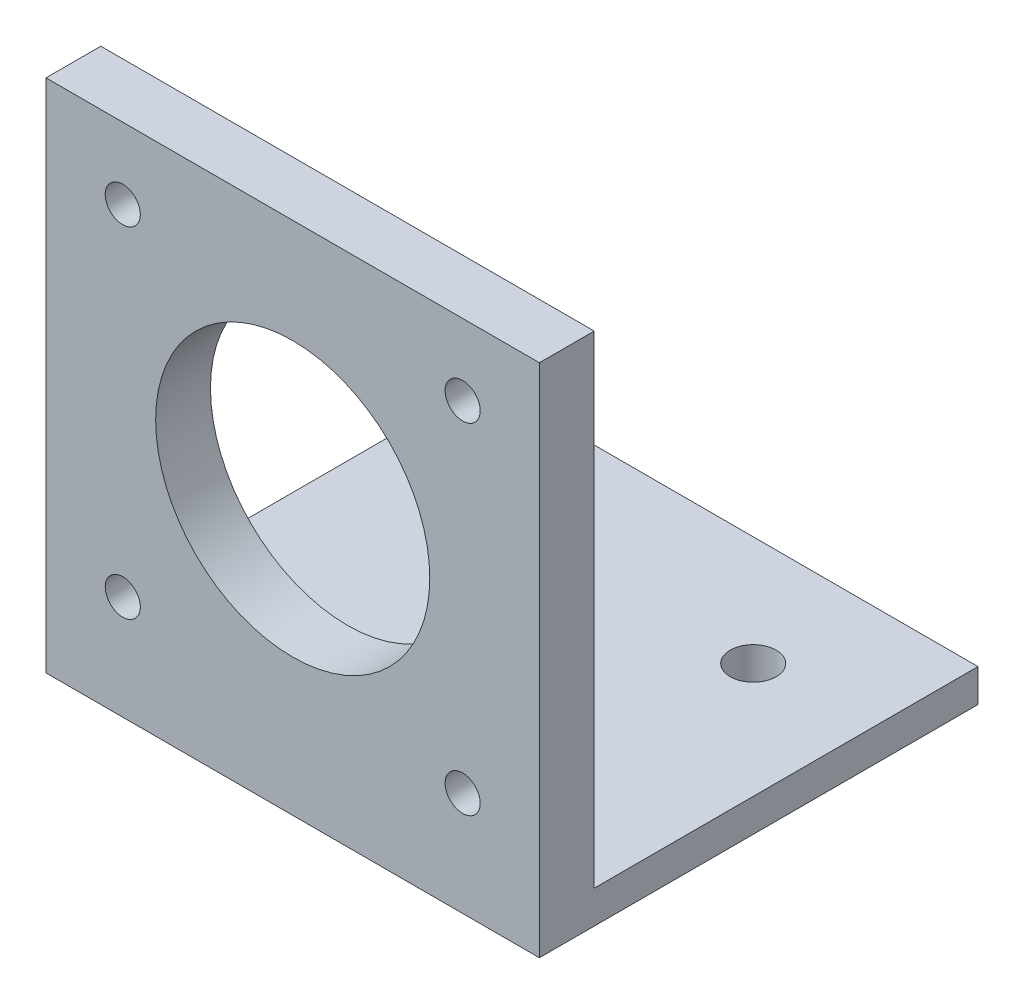
ISO-10303-21;
HEADER;
FILE_DESCRIPTION(('STEP AP214'),'2;1');
FILE_NAME('part.step','',(''),(''),'','','');
FILE_SCHEMA(('AUTOMOTIVE_DESIGN { 1 0 10303 214 1 1 1 1 }'));
ENDSEC;
DATA;
#1=APPLICATION_CONTEXT('core data for automotive mechanical design processes');
#2=APPLICATION_PROTOCOL_DEFINITION('international standard','automotive_design',2000,#1);
#3=PRODUCT_CONTEXT('',#1,'mechanical');
#4=PRODUCT('Part','Part','',(#3));
#5=PRODUCT_RELATED_PRODUCT_CATEGORY('part','',(#4));
#6=PRODUCT_DEFINITION_FORMATION('','',#4);
#7=PRODUCT_DEFINITION_CONTEXT('part definition',#1,'design');
#8=PRODUCT_DEFINITION('design','',#6,#7);
#9=PRODUCT_DEFINITION_SHAPE('','',#8);
#10=(LENGTH_UNIT() NAMED_UNIT(*) SI_UNIT(.MILLI.,.METRE.));
#11=(NAMED_UNIT(*) PLANE_ANGLE_UNIT() SI_UNIT($,.RADIAN.));
#12=(NAMED_UNIT(*) SI_UNIT($,.STERADIAN.) SOLID_ANGLE_UNIT());
#13=UNCERTAINTY_MEASURE_WITH_UNIT(LENGTH_MEASURE(1.E-05),#10,'distance_accuracy_value','');
#14=(GEOMETRIC_REPRESENTATION_CONTEXT(3) GLOBAL_UNCERTAINTY_ASSIGNED_CONTEXT((#13)) GLOBAL_UNIT_ASSIGNED_CONTEXT((#10,
#11,#12)) REPRESENTATION_CONTEXT('',''));
#15=CARTESIAN_POINT('',(0.,0.,0.));
#16=DIRECTION('',(0.,0.,1.));
#17=DIRECTION('',(1.,0.,0.));
#18=AXIS2_PLACEMENT_3D('',#15,#16,#17);
#19=CARTESIAN_POINT('',(22.5,3.,20.));
#20=DIRECTION('',(-1.,0.,0.));
#21=DIRECTION('',(0.,0.,1.));
#22=AXIS2_PLACEMENT_3D('',#19,#20,#21);
#23=PLANE('',#22);
#24=DIRECTION('',(0.,0.,-1.));
#25=VECTOR('',#24,1.);
#26=CARTESIAN_POINT('',(22.5,0.,20.));
#27=LINE('',#26,#25);
#28=CARTESIAN_POINT('',(22.5,0.,20.));
#29=VERTEX_POINT('',#28);
#30=CARTESIAN_POINT('',(22.5,0.,-20.));
#31=VERTEX_POINT('',#30);
#32=EDGE_CURVE('E95',#29,#31,#27,.T.);
#33=ORIENTED_EDGE('',*,*,#32,.T.);
#34=DIRECTION('',(0.,-1.,0.));
#35=VECTOR('',#34,1.);
#36=CARTESIAN_POINT('',(22.5,3.,-20.));
#37=LINE('',#36,#35);
#38=CARTESIAN_POINT('',(22.5,3.,-20.));
#39=VERTEX_POINT('',#38);
#40=EDGE_CURVE('E11',#39,#31,#37,.T.);
#41=ORIENTED_EDGE('',*,*,#40,.F.);
#42=DIRECTION('',(0.,0.,-1.));
#43=VECTOR('',#42,1.);
#44=CARTESIAN_POINT('',(22.5,3.,20.));
#45=LINE('',#44,#43);
#46=CARTESIAN_POINT('',(22.5,3.,15.));
#47=VERTEX_POINT('',#46);
#48=EDGE_CURVE('E88',#47,#39,#45,.T.);
#49=ORIENTED_EDGE('',*,*,#48,.F.);
#50=DIRECTION('',(0.,-1.,0.));
#51=VECTOR('',#50,1.);
#52=CARTESIAN_POINT('',(22.5,47.,15.));
#53=LINE('',#52,#51);
#54=CARTESIAN_POINT('',(22.5,47.,15.));
#55=VERTEX_POINT('',#54);
#56=EDGE_CURVE('E47',#55,#47,#53,.T.);
#57=ORIENTED_EDGE('',*,*,#56,.F.);
#58=DIRECTION('',(0.,0.,-1.));
#59=VECTOR('',#58,1.);
#60=CARTESIAN_POINT('',(22.5,47.,20.));
#61=LINE('',#60,#59);
#62=CARTESIAN_POINT('',(22.5,47.,20.));
#63=VERTEX_POINT('',#62);
#64=EDGE_CURVE('E97',#63,#55,#61,.T.);
#65=ORIENTED_EDGE('',*,*,#64,.F.);
#66=DIRECTION('',(0.,-1.,0.));
#67=VECTOR('',#66,1.);
#68=CARTESIAN_POINT('',(22.5,3.,20.));
#69=LINE('',#68,#67);
#70=EDGE_CURVE('E81',#63,#29,#69,.T.);
#71=ORIENTED_EDGE('',*,*,#70,.T.);
#72=EDGE_LOOP('',(#33,#41,#49,#57,#65,#71));
#73=FACE_BOUND('',#72,.T.);
#74=ADVANCED_FACE('F33',(#73),#23,.F.);
#75=CARTESIAN_POINT('',(-22.5,3.,-20.));
#76=DIRECTION('',(0.,0.,1.));
#77=DIRECTION('',(1.,0.,0.));
#78=AXIS2_PLACEMENT_3D('',#75,#76,#77);
#79=PLANE('',#78);
#80=DIRECTION('',(-1.,0.,0.));
#81=VECTOR('',#80,1.);
#82=CARTESIAN_POINT('',(-22.5,0.,-20.));
#83=LINE('',#82,#81);
#84=CARTESIAN_POINT('',(-22.5,0.,-20.));
#85=VERTEX_POINT('',#84);
#86=EDGE_CURVE('E101',#31,#85,#83,.T.);
#87=ORIENTED_EDGE('',*,*,#86,.T.);
#88=DIRECTION('',(0.,-1.,0.));
#89=VECTOR('',#88,1.);
#90=CARTESIAN_POINT('',(-22.5,3.,-20.));
#91=LINE('',#90,#89);
#92=CARTESIAN_POINT('',(-22.5,3.,-20.));
#93=VERTEX_POINT('',#92);
#94=EDGE_CURVE('E40',#93,#85,#91,.T.);
#95=ORIENTED_EDGE('',*,*,#94,.F.);
#96=DIRECTION('',(-1.,0.,0.));
#97=VECTOR('',#96,1.);
#98=CARTESIAN_POINT('',(-22.5,3.,-20.));
#99=LINE('',#98,#97);
#100=EDGE_CURVE('E56',#39,#93,#99,.T.);
#101=ORIENTED_EDGE('',*,*,#100,.F.);
#102=ORIENTED_EDGE('',*,*,#40,.T.);
#103=EDGE_LOOP('',(#87,#95,#101,#102));
#104=FACE_BOUND('',#103,.T.);
#105=ADVANCED_FACE('F118',(#104),#79,.F.);
#106=CARTESIAN_POINT('',(-22.5,3.,20.));
#107=DIRECTION('',(1.,0.,0.));
#108=DIRECTION('',(0.,0.,-1.));
#109=AXIS2_PLACEMENT_3D('',#106,#107,#108);
#110=PLANE('',#109);
#111=DIRECTION('',(0.,0.,1.));
#112=VECTOR('',#111,1.);
#113=CARTESIAN_POINT('',(-22.5,0.,20.));
#114=LINE('',#113,#112);
#115=CARTESIAN_POINT('',(-22.5,0.,20.));
#116=VERTEX_POINT('',#115);
#117=EDGE_CURVE('E89',#85,#116,#114,.T.);
#118=ORIENTED_EDGE('',*,*,#117,.T.);
#119=DIRECTION('',(0.,-1.,0.));
#120=VECTOR('',#119,1.);
#121=CARTESIAN_POINT('',(-22.5,3.,20.));
#122=LINE('',#121,#120);
#123=CARTESIAN_POINT('',(-22.5,47.,20.));
#124=VERTEX_POINT('',#123);
#125=EDGE_CURVE('E84',#124,#116,#122,.T.);
#126=ORIENTED_EDGE('',*,*,#125,.F.);
#127=DIRECTION('',(0.,0.,-1.));
#128=VECTOR('',#127,1.);
#129=CARTESIAN_POINT('',(-22.5,47.,20.));
#130=LINE('',#129,#128);
#131=CARTESIAN_POINT('',(-22.5,47.,15.));
#132=VERTEX_POINT('',#131);
#133=EDGE_CURVE('E149',#124,#132,#130,.T.);
#134=ORIENTED_EDGE('',*,*,#133,.T.);
#135=DIRECTION('',(0.,-1.,0.));
#136=VECTOR('',#135,1.);
#137=CARTESIAN_POINT('',(-22.5,47.,15.));
#138=LINE('',#137,#136);
#139=CARTESIAN_POINT('',(-22.5,3.,15.));
#140=VERTEX_POINT('',#139);
#141=EDGE_CURVE('E143',#132,#140,#138,.T.);
#142=ORIENTED_EDGE('',*,*,#141,.T.);
#143=DIRECTION('',(0.,0.,1.));
#144=VECTOR('',#143,1.);
#145=CARTESIAN_POINT('',(-22.5,3.,20.));
#146=LINE('',#145,#144);
#147=EDGE_CURVE('E98',#93,#140,#146,.T.);
#148=ORIENTED_EDGE('',*,*,#147,.F.);
#149=ORIENTED_EDGE('',*,*,#94,.T.);
#150=EDGE_LOOP('',(#118,#126,#134,#142,#148,#149));
#151=FACE_BOUND('',#150,.T.);
#152=ADVANCED_FACE('F115',(#151),#110,.F.);
#153=CARTESIAN_POINT('',(-22.5,3.,20.));
#154=DIRECTION('',(0.,0.,-1.));
#155=DIRECTION('',(-1.,0.,0.));
#156=AXIS2_PLACEMENT_3D('',#153,#154,#155);
#157=PLANE('',#156);
#158=CARTESIAN_POINT('',(0.,25.,20.));
#159=DIRECTION('',(0.,0.,-1.));
#160=DIRECTION('',(-1.,0.,0.));
#161=AXIS2_PLACEMENT_3D('',#158,#159,#160);
#162=CIRCLE('',#161,12.5);
#163=CARTESIAN_POINT('',(-12.5,25.,20.));
#164=VERTEX_POINT('',#163);
#165=EDGE_CURVE('E166',#164,#164,#162,.T.);
#166=ORIENTED_EDGE('',*,*,#165,.T.);
#167=EDGE_LOOP('',(#166));
#168=FACE_BOUND('',#167,.T.);
#169=CARTESIAN_POINT('',(15.5,9.5,20.));
#170=DIRECTION('',(0.,0.,-1.));
#171=DIRECTION('',(1.,0.,0.));
#172=AXIS2_PLACEMENT_3D('',#169,#170,#171);
#173=CIRCLE('',#172,1.6);
#174=CARTESIAN_POINT('',(17.1,9.5,20.));
#175=VERTEX_POINT('',#174);
#176=EDGE_CURVE('E172',#175,#175,#173,.T.);
#177=ORIENTED_EDGE('',*,*,#176,.T.);
#178=EDGE_LOOP('',(#177));
#179=FACE_BOUND('',#178,.T.);
#180=CARTESIAN_POINT('',(-15.5,9.49999999999999,20.));
#181=DIRECTION('',(0.,0.,-1.));
#182=DIRECTION('',(-1.,0.,0.));
#183=AXIS2_PLACEMENT_3D('',#180,#181,#182);
#184=CIRCLE('',#183,1.6);
#185=CARTESIAN_POINT('',(-17.1,9.49999999999999,20.));
#186=VERTEX_POINT('',#185);
#187=EDGE_CURVE('E178',#186,#186,#184,.T.);
#188=ORIENTED_EDGE('',*,*,#187,.T.);
#189=EDGE_LOOP('',(#188));
#190=FACE_BOUND('',#189,.T.);
#191=CARTESIAN_POINT('',(-15.5,40.5,20.));
#192=DIRECTION('',(0.,0.,-1.));
#193=DIRECTION('',(1.,0.,0.));
#194=AXIS2_PLACEMENT_3D('',#191,#192,#193);
#195=CIRCLE('',#194,1.6);
#196=CARTESIAN_POINT('',(-13.9,40.5,20.));
#197=VERTEX_POINT('',#196);
#198=EDGE_CURVE('E160',#197,#197,#195,.T.);
#199=ORIENTED_EDGE('',*,*,#198,.T.);
#200=EDGE_LOOP('',(#199));
#201=FACE_BOUND('',#200,.T.);
#202=CARTESIAN_POINT('',(15.5,40.5,20.));
#203=DIRECTION('',(0.,0.,-1.));
#204=DIRECTION('',(-1.,0.,0.));
#205=AXIS2_PLACEMENT_3D('',#202,#203,#204);
#206=CIRCLE('',#205,1.6);
#207=CARTESIAN_POINT('',(13.9,40.5,20.));
#208=VERTEX_POINT('',#207);
#209=EDGE_CURVE('E150',#208,#208,#206,.T.);
#210=ORIENTED_EDGE('',*,*,#209,.T.);
#211=EDGE_LOOP('',(#210));
#212=FACE_BOUND('',#211,.T.);
#213=DIRECTION('',(1.,0.,0.));
#214=VECTOR('',#213,1.);
#215=CARTESIAN_POINT('',(-22.5,0.,20.));
#216=LINE('',#215,#214);
#217=EDGE_CURVE('E76',#116,#29,#216,.T.);
#218=ORIENTED_EDGE('',*,*,#217,.T.);
#219=ORIENTED_EDGE('',*,*,#70,.F.);
#220=DIRECTION('',(1.,0.,0.));
#221=VECTOR('',#220,1.);
#222=CARTESIAN_POINT('',(-22.5,47.,20.));
#223=LINE('',#222,#221);
#224=EDGE_CURVE('E145',#124,#63,#223,.T.);
#225=ORIENTED_EDGE('',*,*,#224,.F.);
#226=ORIENTED_EDGE('',*,*,#125,.T.);
#227=EDGE_LOOP('',(#218,#219,#225,#226));
#228=FACE_BOUND('',#227,.T.);
#229=ADVANCED_FACE('F78',(#168,#179,#190,#201,#212,#228),#157,.F.);
#230=CARTESIAN_POINT('',(0.,3.,0.));
#231=DIRECTION('',(0.,-1.,0.));
#232=DIRECTION('',(0.,0.,-1.));
#233=AXIS2_PLACEMENT_3D('',#230,#231,#232);
#234=PLANE('',#233);
#235=CARTESIAN_POINT('',(-12.,3.,10.));
#236=DIRECTION('',(0.,1.,0.));
#237=DIRECTION('',(0.,0.,-1.));
#238=AXIS2_PLACEMENT_3D('',#235,#236,#237);
#239=CIRCLE('',#238,2.1);
#240=CARTESIAN_POINT('',(-12.,3.,7.9));
#241=VERTEX_POINT('',#240);
#242=EDGE_CURVE('E126',#241,#241,#239,.T.);
#243=ORIENTED_EDGE('',*,*,#242,.F.);
#244=EDGE_LOOP('',(#243));
#245=FACE_BOUND('',#244,.T.);
#246=CARTESIAN_POINT('',(12.,3.,10.));
#247=DIRECTION('',(0.,1.,0.));
#248=DIRECTION('',(0.,0.,1.));
#249=AXIS2_PLACEMENT_3D('',#246,#247,#248);
#250=CIRCLE('',#249,2.1);
#251=CARTESIAN_POINT('',(12.,3.,12.1));
#252=VERTEX_POINT('',#251);
#253=EDGE_CURVE('E132',#252,#252,#250,.T.);
#254=ORIENTED_EDGE('',*,*,#253,.F.);
#255=EDGE_LOOP('',(#254));
#256=FACE_BOUND('',#255,.T.);
#257=CARTESIAN_POINT('',(12.,3.,-10.));
#258=DIRECTION('',(0.,1.,0.));
#259=DIRECTION('',(0.,0.,-1.));
#260=AXIS2_PLACEMENT_3D('',#257,#258,#259);
#261=CIRCLE('',#260,2.1);
#262=CARTESIAN_POINT('',(12.,3.,-12.1));
#263=VERTEX_POINT('',#262);
#264=EDGE_CURVE('E138',#263,#263,#261,.T.);
#265=ORIENTED_EDGE('',*,*,#264,.F.);
#266=EDGE_LOOP('',(#265));
#267=FACE_BOUND('',#266,.T.);
#268=CARTESIAN_POINT('',(-12.,3.,-10.));
#269=DIRECTION('',(0.,1.,0.));
#270=DIRECTION('',(0.,0.,1.));
#271=AXIS2_PLACEMENT_3D('',#268,#269,#270);
#272=CIRCLE('',#271,2.1);
#273=CARTESIAN_POINT('',(-12.,3.,-7.9));
#274=VERTEX_POINT('',#273);
#275=EDGE_CURVE('E106',#274,#274,#272,.T.);
#276=ORIENTED_EDGE('',*,*,#275,.F.);
#277=EDGE_LOOP('',(#276));
#278=FACE_BOUND('',#277,.T.);
#279=ORIENTED_EDGE('',*,*,#147,.T.);
#280=DIRECTION('',(1.,0.,0.));
#281=VECTOR('',#280,1.);
#282=CARTESIAN_POINT('',(-22.5,3.,15.));
#283=LINE('',#282,#281);
#284=EDGE_CURVE('E147',#140,#47,#283,.T.);
#285=ORIENTED_EDGE('',*,*,#284,.T.);
#286=ORIENTED_EDGE('',*,*,#48,.T.);
#287=ORIENTED_EDGE('',*,*,#100,.T.);
#288=EDGE_LOOP('',(#279,#285,#286,#287));
#289=FACE_BOUND('',#288,.T.);
#290=ADVANCED_FACE('F209',(#245,#256,#267,#278,#289),#234,.F.);
#291=CARTESIAN_POINT('',(0.,0.,0.));
#292=DIRECTION('',(0.,-1.,0.));
#293=DIRECTION('',(0.,0.,-1.));
#294=AXIS2_PLACEMENT_3D('',#291,#292,#293);
#295=PLANE('',#294);
#296=CARTESIAN_POINT('',(-12.,0.,10.));
#297=DIRECTION('',(0.,1.,0.));
#298=DIRECTION('',(0.,0.,-1.));
#299=AXIS2_PLACEMENT_3D('',#296,#297,#298);
#300=CIRCLE('',#299,2.1);
#301=CARTESIAN_POINT('',(-12.,0.,7.9));
#302=VERTEX_POINT('',#301);
#303=EDGE_CURVE('E129',#302,#302,#300,.T.);
#304=ORIENTED_EDGE('',*,*,#303,.T.);
#305=EDGE_LOOP('',(#304));
#306=FACE_BOUND('',#305,.T.);
#307=CARTESIAN_POINT('',(12.,0.,10.));
#308=DIRECTION('',(0.,1.,0.));
#309=DIRECTION('',(0.,0.,1.));
#310=AXIS2_PLACEMENT_3D('',#307,#308,#309);
#311=CIRCLE('',#310,2.1);
#312=CARTESIAN_POINT('',(12.,0.,12.1));
#313=VERTEX_POINT('',#312);
#314=EDGE_CURVE('E135',#313,#313,#311,.T.);
#315=ORIENTED_EDGE('',*,*,#314,.T.);
#316=EDGE_LOOP('',(#315));
#317=FACE_BOUND('',#316,.T.);
#318=CARTESIAN_POINT('',(12.,0.,-10.));
#319=DIRECTION('',(0.,1.,0.));
#320=DIRECTION('',(0.,0.,-1.));
#321=AXIS2_PLACEMENT_3D('',#318,#319,#320);
#322=CIRCLE('',#321,2.1);
#323=CARTESIAN_POINT('',(12.,0.,-12.1));
#324=VERTEX_POINT('',#323);
#325=EDGE_CURVE('E124',#324,#324,#322,.T.);
#326=ORIENTED_EDGE('',*,*,#325,.T.);
#327=EDGE_LOOP('',(#326));
#328=FACE_BOUND('',#327,.T.);
#329=CARTESIAN_POINT('',(-12.,0.,-10.));
#330=DIRECTION('',(0.,1.,0.));
#331=DIRECTION('',(0.,0.,1.));
#332=AXIS2_PLACEMENT_3D('',#329,#330,#331);
#333=CIRCLE('',#332,2.1);
#334=CARTESIAN_POINT('',(-12.,0.,-7.9));
#335=VERTEX_POINT('',#334);
#336=EDGE_CURVE('E102',#335,#335,#333,.T.);
#337=ORIENTED_EDGE('',*,*,#336,.T.);
#338=EDGE_LOOP('',(#337));
#339=FACE_BOUND('',#338,.T.);
#340=ORIENTED_EDGE('',*,*,#32,.F.);
#341=ORIENTED_EDGE('',*,*,#217,.F.);
#342=ORIENTED_EDGE('',*,*,#117,.F.);
#343=ORIENTED_EDGE('',*,*,#86,.F.);
#344=EDGE_LOOP('',(#340,#341,#342,#343));
#345=FACE_BOUND('',#344,.T.);
#346=ADVANCED_FACE('F100',(#306,#317,#328,#339,#345),#295,.T.);
#347=CARTESIAN_POINT('',(-12.,0.,-10.));
#348=DIRECTION('',(0.,1.,0.));
#349=DIRECTION('',(0.,0.,1.));
#350=AXIS2_PLACEMENT_3D('',#347,#348,#349);
#351=CYLINDRICAL_SURFACE('',#350,2.1);
#352=ORIENTED_EDGE('',*,*,#336,.F.);
#353=EDGE_LOOP('',(#352));
#354=FACE_BOUND('',#353,.T.);
#355=ORIENTED_EDGE('',*,*,#275,.T.);
#356=EDGE_LOOP('',(#355));
#357=FACE_BOUND('',#356,.T.);
#358=ADVANCED_FACE('F217',(#354,#357),#351,.F.);
#359=CARTESIAN_POINT('',(12.,0.,-10.));
#360=DIRECTION('',(0.,1.,0.));
#361=DIRECTION('',(0.,0.,1.));
#362=AXIS2_PLACEMENT_3D('',#359,#360,#361);
#363=CYLINDRICAL_SURFACE('',#362,2.1);
#364=ORIENTED_EDGE('',*,*,#325,.F.);
#365=EDGE_LOOP('',(#364));
#366=FACE_BOUND('',#365,.T.);
#367=ORIENTED_EDGE('',*,*,#264,.T.);
#368=EDGE_LOOP('',(#367));
#369=FACE_BOUND('',#368,.T.);
#370=ADVANCED_FACE('F304',(#366,#369),#363,.F.);
#371=CARTESIAN_POINT('',(12.,0.,10.));
#372=DIRECTION('',(0.,1.,0.));
#373=DIRECTION('',(0.,0.,1.));
#374=AXIS2_PLACEMENT_3D('',#371,#372,#373);
#375=CYLINDRICAL_SURFACE('',#374,2.1);
#376=ORIENTED_EDGE('',*,*,#314,.F.);
#377=EDGE_LOOP('',(#376));
#378=FACE_BOUND('',#377,.T.);
#379=ORIENTED_EDGE('',*,*,#253,.T.);
#380=EDGE_LOOP('',(#379));
#381=FACE_BOUND('',#380,.T.);
#382=ADVANCED_FACE('F307',(#378,#381),#375,.F.);
#383=CARTESIAN_POINT('',(-12.,0.,10.));
#384=DIRECTION('',(0.,1.,0.));
#385=DIRECTION('',(0.,0.,1.));
#386=AXIS2_PLACEMENT_3D('',#383,#384,#385);
#387=CYLINDRICAL_SURFACE('',#386,2.1);
#388=ORIENTED_EDGE('',*,*,#303,.F.);
#389=EDGE_LOOP('',(#388));
#390=FACE_BOUND('',#389,.T.);
#391=ORIENTED_EDGE('',*,*,#242,.T.);
#392=EDGE_LOOP('',(#391));
#393=FACE_BOUND('',#392,.T.);
#394=ADVANCED_FACE('F201',(#390,#393),#387,.F.);
#395=CARTESIAN_POINT('',(-22.5,47.,15.));
#396=DIRECTION('',(0.,0.,-1.));
#397=DIRECTION('',(-1.,0.,0.));
#398=AXIS2_PLACEMENT_3D('',#395,#396,#397);
#399=PLANE('',#398);
#400=CARTESIAN_POINT('',(0.,25.,15.));
#401=DIRECTION('',(0.,0.,-1.));
#402=DIRECTION('',(-1.,0.,0.));
#403=AXIS2_PLACEMENT_3D('',#400,#401,#402);
#404=CIRCLE('',#403,12.5);
#405=CARTESIAN_POINT('',(-12.5,25.,15.));
#406=VERTEX_POINT('',#405);
#407=EDGE_CURVE('E163',#406,#406,#404,.T.);
#408=ORIENTED_EDGE('',*,*,#407,.F.);
#409=EDGE_LOOP('',(#408));
#410=FACE_BOUND('',#409,.T.);
#411=CARTESIAN_POINT('',(15.5,9.5,15.));
#412=DIRECTION('',(0.,0.,-1.));
#413=DIRECTION('',(1.,0.,0.));
#414=AXIS2_PLACEMENT_3D('',#411,#412,#413);
#415=CIRCLE('',#414,1.6);
#416=CARTESIAN_POINT('',(17.1,9.5,15.));
#417=VERTEX_POINT('',#416);
#418=EDGE_CURVE('E169',#417,#417,#415,.T.);
#419=ORIENTED_EDGE('',*,*,#418,.F.);
#420=EDGE_LOOP('',(#419));
#421=FACE_BOUND('',#420,.T.);
#422=CARTESIAN_POINT('',(-15.5,9.49999999999999,15.));
#423=DIRECTION('',(0.,0.,-1.));
#424=DIRECTION('',(-1.,0.,0.));
#425=AXIS2_PLACEMENT_3D('',#422,#423,#424);
#426=CIRCLE('',#425,1.6);
#427=CARTESIAN_POINT('',(-17.1,9.49999999999999,15.));
#428=VERTEX_POINT('',#427);
#429=EDGE_CURVE('E175',#428,#428,#426,.T.);
#430=ORIENTED_EDGE('',*,*,#429,.F.);
#431=EDGE_LOOP('',(#430));
#432=FACE_BOUND('',#431,.T.);
#433=CARTESIAN_POINT('',(-15.5,40.5,15.));
#434=DIRECTION('',(0.,0.,-1.));
#435=DIRECTION('',(1.,0.,0.));
#436=AXIS2_PLACEMENT_3D('',#433,#434,#435);
#437=CIRCLE('',#436,1.6);
#438=CARTESIAN_POINT('',(-13.9,40.5,15.));
#439=VERTEX_POINT('',#438);
#440=EDGE_CURVE('E181',#439,#439,#437,.T.);
#441=ORIENTED_EDGE('',*,*,#440,.F.);
#442=EDGE_LOOP('',(#441));
#443=FACE_BOUND('',#442,.T.);
#444=CARTESIAN_POINT('',(15.5,40.5,15.));
#445=DIRECTION('',(0.,0.,-1.));
#446=DIRECTION('',(-1.,0.,0.));
#447=AXIS2_PLACEMENT_3D('',#444,#445,#446);
#448=CIRCLE('',#447,1.6);
#449=CARTESIAN_POINT('',(13.9,40.5,15.));
#450=VERTEX_POINT('',#449);
#451=EDGE_CURVE('E157',#450,#450,#448,.T.);
#452=ORIENTED_EDGE('',*,*,#451,.F.);
#453=EDGE_LOOP('',(#452));
#454=FACE_BOUND('',#453,.T.);
#455=ORIENTED_EDGE('',*,*,#284,.F.);
#456=ORIENTED_EDGE('',*,*,#141,.F.);
#457=DIRECTION('',(1.,0.,0.));
#458=VECTOR('',#457,1.);
#459=CARTESIAN_POINT('',(-22.5,47.,15.));
#460=LINE('',#459,#458);
#461=EDGE_CURVE('E153',#132,#55,#460,.T.);
#462=ORIENTED_EDGE('',*,*,#461,.T.);
#463=ORIENTED_EDGE('',*,*,#56,.T.);
#464=EDGE_LOOP('',(#455,#456,#462,#463));
#465=FACE_BOUND('',#464,.T.);
#466=ADVANCED_FACE('F197',(#410,#421,#432,#443,#454,#465),#399,.T.);
#467=CARTESIAN_POINT('',(0.,47.,0.));
#468=DIRECTION('',(0.,-1.,0.));
#469=DIRECTION('',(0.,0.,-1.));
#470=AXIS2_PLACEMENT_3D('',#467,#468,#469);
#471=PLANE('',#470);
#472=ORIENTED_EDGE('',*,*,#133,.F.);
#473=ORIENTED_EDGE('',*,*,#224,.T.);
#474=ORIENTED_EDGE('',*,*,#64,.T.);
#475=ORIENTED_EDGE('',*,*,#461,.F.);
#476=EDGE_LOOP('',(#472,#473,#474,#475));
#477=FACE_BOUND('',#476,.T.);
#478=ADVANCED_FACE('F200',(#477),#471,.F.);
#479=CARTESIAN_POINT('',(15.5,40.5,20.));
#480=DIRECTION('',(0.,0.,-1.));
#481=DIRECTION('',(-1.,0.,0.));
#482=AXIS2_PLACEMENT_3D('',#479,#480,#481);
#483=CYLINDRICAL_SURFACE('',#482,1.6);
#484=ORIENTED_EDGE('',*,*,#209,.F.);
#485=EDGE_LOOP('',(#484));
#486=FACE_BOUND('',#485,.T.);
#487=ORIENTED_EDGE('',*,*,#451,.T.);
#488=EDGE_LOOP('',(#487));
#489=FACE_BOUND('',#488,.T.);
#490=ADVANCED_FACE('F193',(#486,#489),#483,.F.);
#491=CARTESIAN_POINT('',(-15.5,40.5,20.));
#492=DIRECTION('',(0.,0.,-1.));
#493=DIRECTION('',(-1.,0.,0.));
#494=AXIS2_PLACEMENT_3D('',#491,#492,#493);
#495=CYLINDRICAL_SURFACE('',#494,1.6);
#496=ORIENTED_EDGE('',*,*,#198,.F.);
#497=EDGE_LOOP('',(#496));
#498=FACE_BOUND('',#497,.T.);
#499=ORIENTED_EDGE('',*,*,#440,.T.);
#500=EDGE_LOOP('',(#499));
#501=FACE_BOUND('',#500,.T.);
#502=ADVANCED_FACE('F189',(#498,#501),#495,.F.);
#503=CARTESIAN_POINT('',(-15.5,9.49999999999999,20.));
#504=DIRECTION('',(0.,0.,-1.));
#505=DIRECTION('',(-1.,0.,0.));
#506=AXIS2_PLACEMENT_3D('',#503,#504,#505);
#507=CYLINDRICAL_SURFACE('',#506,1.6);
#508=ORIENTED_EDGE('',*,*,#187,.F.);
#509=EDGE_LOOP('',(#508));
#510=FACE_BOUND('',#509,.T.);
#511=ORIENTED_EDGE('',*,*,#429,.T.);
#512=EDGE_LOOP('',(#511));
#513=FACE_BOUND('',#512,.T.);
#514=ADVANCED_FACE('F192',(#510,#513),#507,.F.);
#515=CARTESIAN_POINT('',(15.5,9.5,20.));
#516=DIRECTION('',(0.,0.,-1.));
#517=DIRECTION('',(-1.,0.,0.));
#518=AXIS2_PLACEMENT_3D('',#515,#516,#517);
#519=CYLINDRICAL_SURFACE('',#518,1.6);
#520=ORIENTED_EDGE('',*,*,#176,.F.);
#521=EDGE_LOOP('',(#520));
#522=FACE_BOUND('',#521,.T.);
#523=ORIENTED_EDGE('',*,*,#418,.T.);
#524=EDGE_LOOP('',(#523));
#525=FACE_BOUND('',#524,.T.);
#526=ADVANCED_FACE('F275',(#522,#525),#519,.F.);
#527=CARTESIAN_POINT('',(0.,25.,20.));
#528=DIRECTION('',(0.,0.,-1.));
#529=DIRECTION('',(-1.,0.,0.));
#530=AXIS2_PLACEMENT_3D('',#527,#528,#529);
#531=CYLINDRICAL_SURFACE('',#530,12.5);
#532=ORIENTED_EDGE('',*,*,#165,.F.);
#533=EDGE_LOOP('',(#532));
#534=FACE_BOUND('',#533,.T.);
#535=ORIENTED_EDGE('',*,*,#407,.T.);
#536=EDGE_LOOP('',(#535));
#537=FACE_BOUND('',#536,.T.);
#538=ADVANCED_FACE('F285',(#534,#537),#531,.F.);
#539=CLOSED_SHELL('',(#74,#105,#152,#229,#290,#346,#358,#370,#382,#394,#466,#478,#490,#502,#514,
#526,#538));
#540=MANIFOLD_SOLID_BREP('B2',#539);
#541=ADVANCED_BREP_SHAPE_REPRESENTATION('',(#18,#540),#14);
#542=SHAPE_DEFINITION_REPRESENTATION(#9,#541);
ENDSEC;
END-ISO-10303-21;
